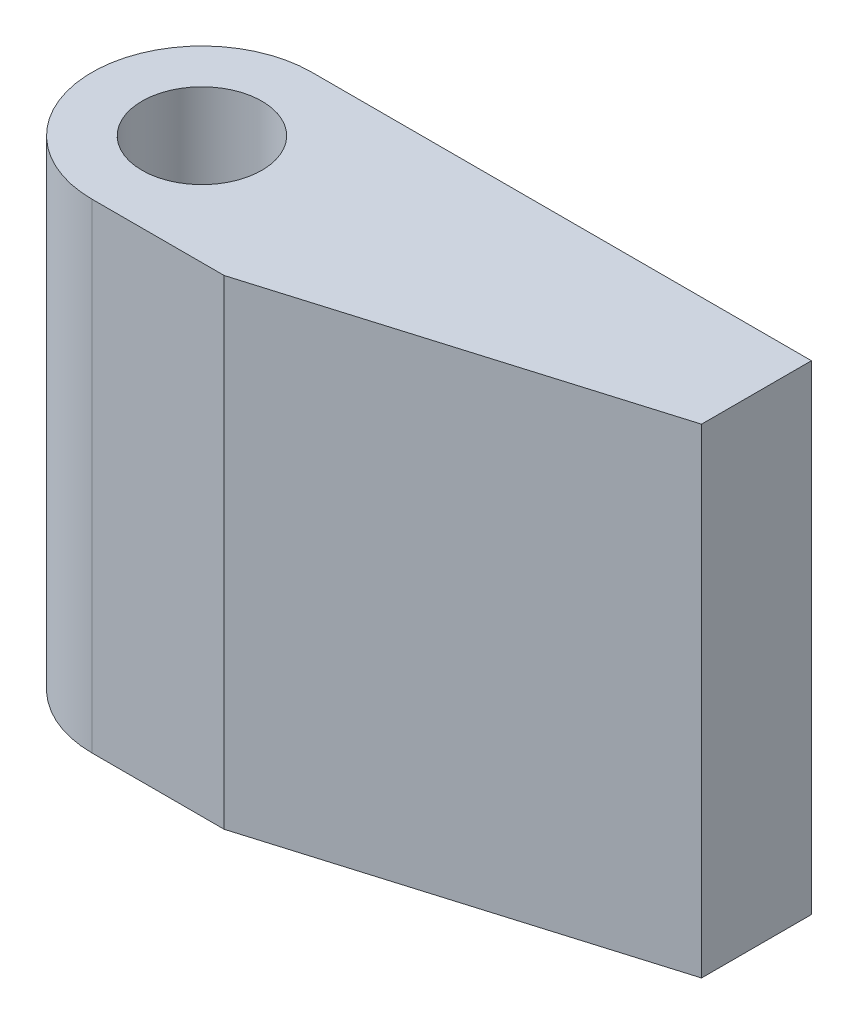
ISO-10303-21;
HEADER;
FILE_DESCRIPTION(('STEP AP214'),'2;1');
FILE_NAME('part.step','',(''),(''),'','','');
FILE_SCHEMA(('AUTOMOTIVE_DESIGN { 1 0 10303 214 1 1 1 1 }'));
ENDSEC;
DATA;
#1=APPLICATION_CONTEXT('core data for automotive mechanical design processes');
#2=APPLICATION_PROTOCOL_DEFINITION('international standard','automotive_design',2000,#1);
#3=PRODUCT_CONTEXT('',#1,'mechanical');
#4=PRODUCT('Part','Part','',(#3));
#5=PRODUCT_RELATED_PRODUCT_CATEGORY('part','',(#4));
#6=PRODUCT_DEFINITION_FORMATION('','',#4);
#7=PRODUCT_DEFINITION_CONTEXT('part definition',#1,'design');
#8=PRODUCT_DEFINITION('design','',#6,#7);
#9=PRODUCT_DEFINITION_SHAPE('','',#8);
#10=(LENGTH_UNIT() NAMED_UNIT(*) SI_UNIT(.MILLI.,.METRE.));
#11=(NAMED_UNIT(*) PLANE_ANGLE_UNIT() SI_UNIT($,.RADIAN.));
#12=(NAMED_UNIT(*) SI_UNIT($,.STERADIAN.) SOLID_ANGLE_UNIT());
#13=UNCERTAINTY_MEASURE_WITH_UNIT(LENGTH_MEASURE(1.E-05),#10,'distance_accuracy_value','');
#14=(GEOMETRIC_REPRESENTATION_CONTEXT(3) GLOBAL_UNCERTAINTY_ASSIGNED_CONTEXT((#13)) GLOBAL_UNIT_ASSIGNED_CONTEXT((#10,
#11,#12)) REPRESENTATION_CONTEXT('',''));
#15=CARTESIAN_POINT('',(0.,0.,0.));
#16=DIRECTION('',(0.,0.,1.));
#17=DIRECTION('',(1.,0.,0.));
#18=AXIS2_PLACEMENT_3D('',#15,#16,#17);
#19=CARTESIAN_POINT('',(10.,-5.,-2.2));
#20=DIRECTION('',(-1.,0.,0.));
#21=DIRECTION('',(0.,0.,1.));
#22=AXIS2_PLACEMENT_3D('',#19,#20,#21);
#23=PLANE('',#22);
#24=DIRECTION('',(0.,0.,-1.));
#25=VECTOR('',#24,1.);
#26=CARTESIAN_POINT('',(10.,4.8,2.2));
#27=LINE('',#26,#25);
#28=CARTESIAN_POINT('',(10.,4.8,0.));
#29=VERTEX_POINT('',#28);
#30=CARTESIAN_POINT('',(10.,4.8,-2.2));
#31=VERTEX_POINT('',#30);
#32=EDGE_CURVE('E55',#29,#31,#27,.T.);
#33=ORIENTED_EDGE('',*,*,#32,.F.);
#34=DIRECTION('',(0.,1.,0.));
#35=VECTOR('',#34,1.);
#36=CARTESIAN_POINT('',(10.,-5.2,0.));
#37=LINE('',#36,#35);
#38=CARTESIAN_POINT('',(10.,-4.8,0.));
#39=VERTEX_POINT('',#38);
#40=EDGE_CURVE('E48',#39,#29,#37,.T.);
#41=ORIENTED_EDGE('',*,*,#40,.F.);
#42=DIRECTION('',(0.,0.,-1.));
#43=VECTOR('',#42,1.);
#44=CARTESIAN_POINT('',(10.,-4.8,2.2));
#45=LINE('',#44,#43);
#46=CARTESIAN_POINT('',(10.,-4.8,-2.2));
#47=VERTEX_POINT('',#46);
#48=EDGE_CURVE('E106',#39,#47,#45,.T.);
#49=ORIENTED_EDGE('',*,*,#48,.T.);
#50=DIRECTION('',(0.,1.,0.));
#51=VECTOR('',#50,1.);
#52=CARTESIAN_POINT('',(10.,-5.,-2.2));
#53=LINE('',#52,#51);
#54=EDGE_CURVE('E115',#47,#31,#53,.T.);
#55=ORIENTED_EDGE('',*,*,#54,.T.);
#56=EDGE_LOOP('',(#33,#41,#49,#55));
#57=FACE_BOUND('',#56,.T.);
#58=ADVANCED_FACE('F32',(#57),#23,.F.);
#59=CARTESIAN_POINT('',(10.,-5.,2.2));
#60=DIRECTION('',(0.,0.,-1.));
#61=DIRECTION('',(-1.,0.,0.));
#62=AXIS2_PLACEMENT_3D('',#59,#60,#61);
#63=PLANE('',#62);
#64=DIRECTION('',(-1.,0.,0.));
#65=VECTOR('',#64,1.);
#66=CARTESIAN_POINT('',(10.,-4.8,2.2));
#67=LINE('',#66,#65);
#68=CARTESIAN_POINT('',(2.64532497192921,-4.8,2.2));
#69=VERTEX_POINT('',#68);
#70=CARTESIAN_POINT('',(0.,-4.8,2.2));
#71=VERTEX_POINT('',#70);
#72=EDGE_CURVE('E90',#69,#71,#67,.T.);
#73=ORIENTED_EDGE('',*,*,#72,.F.);
#74=DIRECTION('',(0.,1.,0.));
#75=VECTOR('',#74,1.);
#76=CARTESIAN_POINT('',(2.64532497192921,-5.2,2.2));
#77=LINE('',#76,#75);
#78=CARTESIAN_POINT('',(2.64532497192921,4.8,2.2));
#79=VERTEX_POINT('',#78);
#80=EDGE_CURVE('E80',#69,#79,#77,.T.);
#81=ORIENTED_EDGE('',*,*,#80,.T.);
#82=DIRECTION('',(-1.,0.,0.));
#83=VECTOR('',#82,1.);
#84=CARTESIAN_POINT('',(10.,4.8,2.2));
#85=LINE('',#84,#83);
#86=CARTESIAN_POINT('',(0.,4.8,2.2));
#87=VERTEX_POINT('',#86);
#88=EDGE_CURVE('E88',#79,#87,#85,.T.);
#89=ORIENTED_EDGE('',*,*,#88,.T.);
#90=DIRECTION('',(0.,1.,0.));
#91=VECTOR('',#90,1.);
#92=CARTESIAN_POINT('',(0.,-5.,2.2));
#93=LINE('',#92,#91);
#94=EDGE_CURVE('E11',#71,#87,#93,.T.);
#95=ORIENTED_EDGE('',*,*,#94,.F.);
#96=EDGE_LOOP('',(#73,#81,#89,#95));
#97=FACE_BOUND('',#96,.T.);
#98=ADVANCED_FACE('F86',(#97),#63,.F.);
#99=CARTESIAN_POINT('',(0.,-5.,0.));
#100=DIRECTION('',(0.,1.,0.));
#101=DIRECTION('',(0.,0.,1.));
#102=AXIS2_PLACEMENT_3D('',#99,#100,#101);
#103=CYLINDRICAL_SURFACE('',#102,2.2);
#104=ORIENTED_EDGE('',*,*,#94,.T.);
#105=CARTESIAN_POINT('',(0.,4.8,0.));
#106=DIRECTION('',(0.,1.,0.));
#107=DIRECTION('',(0.,0.,1.));
#108=AXIS2_PLACEMENT_3D('',#105,#106,#107);
#109=CIRCLE('',#108,2.2);
#110=CARTESIAN_POINT('',(0.,4.8,-2.2));
#111=VERTEX_POINT('',#110);
#112=EDGE_CURVE('E96',#87,#111,#109,.F.);
#113=ORIENTED_EDGE('',*,*,#112,.T.);
#114=DIRECTION('',(0.,1.,0.));
#115=VECTOR('',#114,1.);
#116=CARTESIAN_POINT('',(0.,-5.,-2.2));
#117=LINE('',#116,#115);
#118=CARTESIAN_POINT('',(0.,-4.8,-2.2));
#119=VERTEX_POINT('',#118);
#120=EDGE_CURVE('E40',#119,#111,#117,.T.);
#121=ORIENTED_EDGE('',*,*,#120,.F.);
#122=CARTESIAN_POINT('',(0.,-4.8,0.));
#123=DIRECTION('',(0.,-1.,0.));
#124=DIRECTION('',(0.,0.,-1.));
#125=AXIS2_PLACEMENT_3D('',#122,#123,#124);
#126=CIRCLE('',#125,2.2);
#127=EDGE_CURVE('E112',#119,#71,#126,.F.);
#128=ORIENTED_EDGE('',*,*,#127,.T.);
#129=EDGE_LOOP('',(#104,#113,#121,#128));
#130=FACE_BOUND('',#129,.T.);
#131=ADVANCED_FACE('F146',(#130),#103,.T.);
#132=CARTESIAN_POINT('',(0.,-5.,-2.2));
#133=DIRECTION('',(0.,0.,1.));
#134=DIRECTION('',(1.,0.,0.));
#135=AXIS2_PLACEMENT_3D('',#132,#133,#134);
#136=PLANE('',#135);
#137=DIRECTION('',(-1.,0.,0.));
#138=VECTOR('',#137,1.);
#139=CARTESIAN_POINT('',(0.,4.8,-2.2));
#140=LINE('',#139,#138);
#141=EDGE_CURVE('E102',#31,#111,#140,.T.);
#142=ORIENTED_EDGE('',*,*,#141,.F.);
#143=ORIENTED_EDGE('',*,*,#54,.F.);
#144=DIRECTION('',(1.,0.,0.));
#145=VECTOR('',#144,1.);
#146=CARTESIAN_POINT('',(0.,-4.8,-2.2));
#147=LINE('',#146,#145);
#148=EDGE_CURVE('E109',#119,#47,#147,.T.);
#149=ORIENTED_EDGE('',*,*,#148,.F.);
#150=ORIENTED_EDGE('',*,*,#120,.T.);
#151=EDGE_LOOP('',(#142,#143,#149,#150));
#152=FACE_BOUND('',#151,.T.);
#153=ADVANCED_FACE('F127',(#152),#136,.F.);
#154=CARTESIAN_POINT('',(0.,-5.,0.));
#155=DIRECTION('',(0.,1.,0.));
#156=DIRECTION('',(0.,0.,1.));
#157=AXIS2_PLACEMENT_3D('',#154,#155,#156);
#158=CYLINDRICAL_SURFACE('',#157,1.2);
#159=CARTESIAN_POINT('',(0.,-4.8,0.));
#160=DIRECTION('',(0.,-1.,0.));
#161=DIRECTION('',(0.,0.,-1.));
#162=AXIS2_PLACEMENT_3D('',#159,#160,#161);
#163=CIRCLE('',#162,1.2);
#164=CARTESIAN_POINT('',(0.,-4.8,-1.2));
#165=VERTEX_POINT('',#164);
#166=EDGE_CURVE('E108',#165,#165,#163,.F.);
#167=ORIENTED_EDGE('',*,*,#166,.F.);
#168=EDGE_LOOP('',(#167));
#169=FACE_BOUND('',#168,.T.);
#170=CARTESIAN_POINT('',(0.,4.8,0.));
#171=DIRECTION('',(0.,1.,0.));
#172=DIRECTION('',(0.,0.,1.));
#173=AXIS2_PLACEMENT_3D('',#170,#171,#172);
#174=CIRCLE('',#173,1.2);
#175=CARTESIAN_POINT('',(0.,4.8,1.2));
#176=VERTEX_POINT('',#175);
#177=EDGE_CURVE('E35',#176,#176,#174,.F.);
#178=ORIENTED_EDGE('',*,*,#177,.F.);
#179=EDGE_LOOP('',(#178));
#180=FACE_BOUND('',#179,.T.);
#181=ADVANCED_FACE('F124',(#169,#180),#158,.F.);
#182=CARTESIAN_POINT('',(0.,-4.8,0.));
#183=DIRECTION('',(0.,-1.,0.));
#184=DIRECTION('',(0.,0.,-1.));
#185=AXIS2_PLACEMENT_3D('',#182,#183,#184);
#186=PLANE('',#185);
#187=DIRECTION('',(0.958055526856071,0.,-0.286582636355618));
#188=VECTOR('',#187,1.);
#189=CARTESIAN_POINT('',(0.821296074605363,-4.8,2.74562078661483));
#190=LINE('',#189,#188);
#191=EDGE_CURVE('E91',#69,#39,#190,.T.);
#192=ORIENTED_EDGE('',*,*,#191,.F.);
#193=ORIENTED_EDGE('',*,*,#72,.T.);
#194=ORIENTED_EDGE('',*,*,#127,.F.);
#195=ORIENTED_EDGE('',*,*,#148,.T.);
#196=ORIENTED_EDGE('',*,*,#48,.F.);
#197=EDGE_LOOP('',(#192,#193,#194,#195,#196));
#198=FACE_BOUND('',#197,.T.);
#199=ORIENTED_EDGE('',*,*,#166,.T.);
#200=EDGE_LOOP('',(#199));
#201=FACE_BOUND('',#200,.T.);
#202=ADVANCED_FACE('F122',(#198,#201),#186,.T.);
#203=CARTESIAN_POINT('',(0.,4.8,0.));
#204=DIRECTION('',(0.,1.,0.));
#205=DIRECTION('',(0.,0.,-1.));
#206=AXIS2_PLACEMENT_3D('',#203,#204,#205);
#207=PLANE('',#206);
#208=DIRECTION('',(-0.958055526856071,0.,0.286582636355618));
#209=VECTOR('',#208,1.);
#210=CARTESIAN_POINT('',(2.64532497192921,4.8,2.2));
#211=LINE('',#210,#209);
#212=EDGE_CURVE('E77',#29,#79,#211,.T.);
#213=ORIENTED_EDGE('',*,*,#212,.F.);
#214=ORIENTED_EDGE('',*,*,#32,.T.);
#215=ORIENTED_EDGE('',*,*,#141,.T.);
#216=ORIENTED_EDGE('',*,*,#112,.F.);
#217=ORIENTED_EDGE('',*,*,#88,.F.);
#218=EDGE_LOOP('',(#213,#214,#215,#216,#217));
#219=FACE_BOUND('',#218,.T.);
#220=ORIENTED_EDGE('',*,*,#177,.T.);
#221=EDGE_LOOP('',(#220));
#222=FACE_BOUND('',#221,.T.);
#223=ADVANCED_FACE('F93',(#219,#222),#207,.T.);
#224=CARTESIAN_POINT('',(2.64532497192921,-5.2,2.2));
#225=DIRECTION('',(-0.286582636355618,0.,-0.958055526856071));
#226=DIRECTION('',(-0.958055526856071,0.,0.286582636355618));
#227=AXIS2_PLACEMENT_3D('',#224,#225,#226);
#228=PLANE('',#227);
#229=ORIENTED_EDGE('',*,*,#191,.T.);
#230=ORIENTED_EDGE('',*,*,#40,.T.);
#231=ORIENTED_EDGE('',*,*,#212,.T.);
#232=ORIENTED_EDGE('',*,*,#80,.F.);
#233=EDGE_LOOP('',(#229,#230,#231,#232));
#234=FACE_BOUND('',#233,.T.);
#235=ADVANCED_FACE('F79',(#234),#228,.F.);
#236=CLOSED_SHELL('',(#58,#98,#131,#153,#181,#202,#223,#235));
#237=MANIFOLD_SOLID_BREP('B2',#236);
#238=ADVANCED_BREP_SHAPE_REPRESENTATION('',(#18,#237),#14);
#239=SHAPE_DEFINITION_REPRESENTATION(#9,#238);
ENDSEC;
END-ISO-10303-21;
